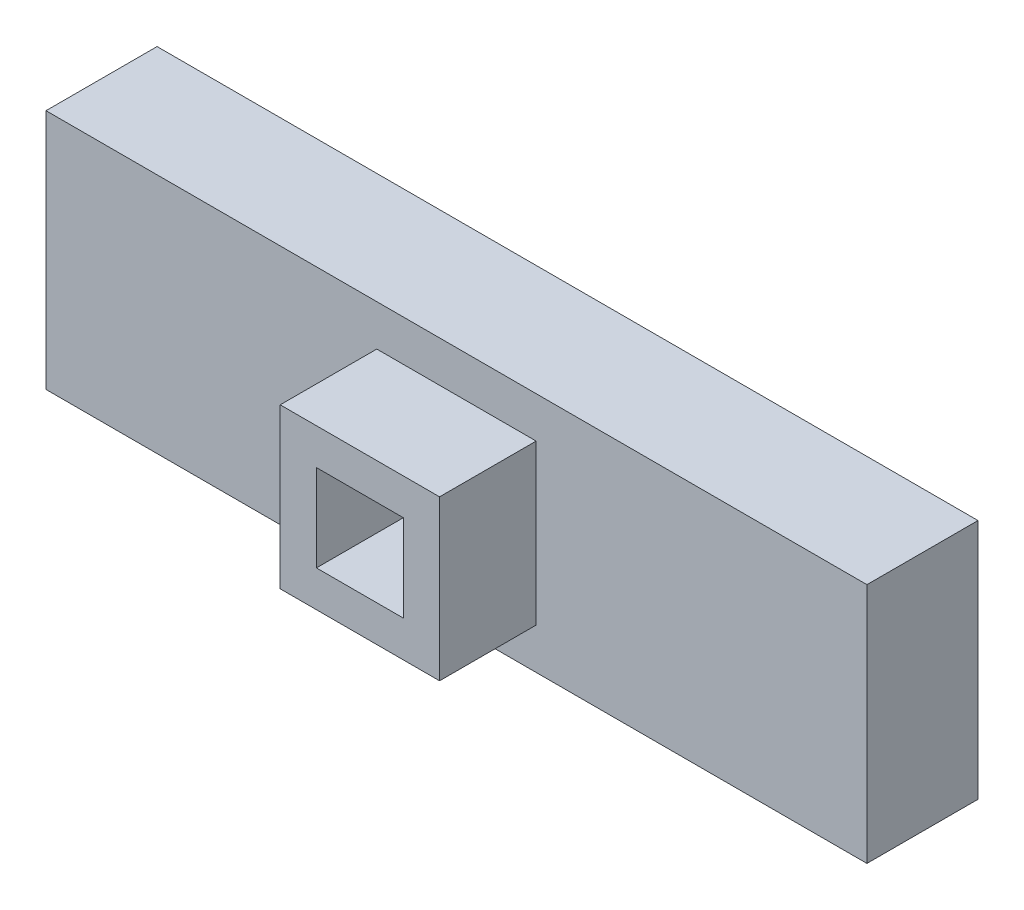
ISO-10303-21;
HEADER;
FILE_DESCRIPTION(('STEP AP214'),'2;1');
FILE_NAME('part.step','',(''),(''),'','','');
FILE_SCHEMA(('AUTOMOTIVE_DESIGN { 1 0 10303 214 1 1 1 1 }'));
ENDSEC;
DATA;
#1=APPLICATION_CONTEXT('core data for automotive mechanical design processes');
#2=APPLICATION_PROTOCOL_DEFINITION('international standard','automotive_design',2000,#1);
#3=PRODUCT_CONTEXT('',#1,'mechanical');
#4=PRODUCT('Part','Part','',(#3));
#5=PRODUCT_RELATED_PRODUCT_CATEGORY('part','',(#4));
#6=PRODUCT_DEFINITION_FORMATION('','',#4);
#7=PRODUCT_DEFINITION_CONTEXT('part definition',#1,'design');
#8=PRODUCT_DEFINITION('design','',#6,#7);
#9=PRODUCT_DEFINITION_SHAPE('','',#8);
#10=(LENGTH_UNIT() NAMED_UNIT(*) SI_UNIT(.MILLI.,.METRE.));
#11=(NAMED_UNIT(*) PLANE_ANGLE_UNIT() SI_UNIT($,.RADIAN.));
#12=(NAMED_UNIT(*) SI_UNIT($,.STERADIAN.) SOLID_ANGLE_UNIT());
#13=UNCERTAINTY_MEASURE_WITH_UNIT(LENGTH_MEASURE(1.E-05),#10,'distance_accuracy_value','');
#14=(GEOMETRIC_REPRESENTATION_CONTEXT(3) GLOBAL_UNCERTAINTY_ASSIGNED_CONTEXT((#13)) GLOBAL_UNIT_ASSIGNED_CONTEXT((#10,
#11,#12)) REPRESENTATION_CONTEXT('',''));
#15=CARTESIAN_POINT('',(0.,0.,0.));
#16=DIRECTION('',(0.,0.,1.));
#17=DIRECTION('',(1.,0.,0.));
#18=AXIS2_PLACEMENT_3D('',#15,#16,#17);
#19=CARTESIAN_POINT('',(0.,0.,0.));
#20=DIRECTION('',(0.,0.,1.));
#21=DIRECTION('',(1.,0.,0.));
#22=AXIS2_PLACEMENT_3D('',#19,#20,#21);
#23=PLANE('',#22);
#24=DIRECTION('',(0.,-1.,0.));
#25=VECTOR('',#24,1.);
#26=CARTESIAN_POINT('',(-45.2171873309762,5.44356955380577,0.));
#27=LINE('',#26,#25);
#28=CARTESIAN_POINT('',(-45.2171873309762,5.44356955380577,0.));
#29=VERTEX_POINT('',#28);
#30=CARTESIAN_POINT('',(-45.2171873309762,-4.55643044619423,0.));
#31=VERTEX_POINT('',#30);
#32=EDGE_CURVE('E315',#29,#31,#27,.T.);
#33=ORIENTED_EDGE('',*,*,#32,.F.);
#34=DIRECTION('',(-1.,0.,0.));
#35=VECTOR('',#34,1.);
#36=CARTESIAN_POINT('',(-45.2171873309762,5.44356955380577,0.));
#37=LINE('',#36,#35);
#38=CARTESIAN_POINT('',(-11.2171873309762,5.44356955380577,0.));
#39=VERTEX_POINT('',#38);
#40=EDGE_CURVE('E322',#39,#29,#37,.T.);
#41=ORIENTED_EDGE('',*,*,#40,.F.);
#42=DIRECTION('',(0.,1.,0.));
#43=VECTOR('',#42,1.);
#44=CARTESIAN_POINT('',(-11.2171873309762,5.44356955380577,0.));
#45=LINE('',#44,#43);
#46=CARTESIAN_POINT('',(-11.2171873309762,-4.55643044619423,0.));
#47=VERTEX_POINT('',#46);
#48=EDGE_CURVE('E320',#47,#39,#45,.T.);
#49=ORIENTED_EDGE('',*,*,#48,.F.);
#50=DIRECTION('',(1.,0.,0.));
#51=VECTOR('',#50,1.);
#52=CARTESIAN_POINT('',(-45.2171873309762,-4.55643044619423,0.));
#53=LINE('',#52,#51);
#54=EDGE_CURVE('E318',#31,#47,#53,.T.);
#55=ORIENTED_EDGE('',*,*,#54,.F.);
#56=EDGE_LOOP('',(#33,#41,#49,#55));
#57=FACE_BOUND('',#56,.T.);
#58=CARTESIAN_POINT('',(-14.2171873309762,0.443569553805773,0.));
#59=DIRECTION('',(0.,0.,1.));
#60=DIRECTION('',(-1.,0.,0.));
#61=AXIS2_PLACEMENT_3D('',#58,#59,#60);
#62=CIRCLE('',#61,2.);
#63=CARTESIAN_POINT('',(-14.2171873309762,-1.55643044619423,0.));
#64=VERTEX_POINT('',#63);
#65=CARTESIAN_POINT('',(-14.2171873309762,2.44356955380577,0.));
#66=VERTEX_POINT('',#65);
#67=EDGE_CURVE('E249',#64,#66,#62,.T.);
#68=ORIENTED_EDGE('',*,*,#67,.T.);
#69=DIRECTION('',(-0.994557414695274,0.104189965326093,0.));
#70=VECTOR('',#69,1.);
#71=CARTESIAN_POINT('',(-25.8409847127156,3.66128009345523,0.));
#72=LINE('',#71,#70);
#73=CARTESIAN_POINT('',(-25.8409847127156,3.66128009345523,0.));
#74=VERTEX_POINT('',#73);
#75=EDGE_CURVE('E278',#66,#74,#72,.T.);
#76=ORIENTED_EDGE('',*,*,#75,.T.);
#77=CARTESIAN_POINT('',(-28.2171873309762,0.443569553805759,0.));
#78=DIRECTION('',(0.,0.,1.));
#79=DIRECTION('',(-1.,0.,0.));
#80=AXIS2_PLACEMENT_3D('',#77,#78,#79);
#81=CIRCLE('',#80,4.00000000000001);
#82=CARTESIAN_POINT('',(-30.5933899492369,3.66128009345523,0.));
#83=VERTEX_POINT('',#82);
#84=EDGE_CURVE('E281',#74,#83,#81,.T.);
#85=ORIENTED_EDGE('',*,*,#84,.T.);
#86=DIRECTION('',(-0.994557414695274,-0.104189965326093,0.));
#87=VECTOR('',#86,1.);
#88=CARTESIAN_POINT('',(-30.5933899492369,3.66128009345523,0.));
#89=LINE('',#88,#87);
#90=CARTESIAN_POINT('',(-42.2171873309763,2.44356955380577,0.));
#91=VERTEX_POINT('',#90);
#92=EDGE_CURVE('E284',#83,#91,#89,.T.);
#93=ORIENTED_EDGE('',*,*,#92,.T.);
#94=CARTESIAN_POINT('',(-42.2171873309763,0.443569553805773,0.));
#95=DIRECTION('',(0.,0.,1.));
#96=DIRECTION('',(1.,0.,0.));
#97=AXIS2_PLACEMENT_3D('',#94,#95,#96);
#98=CIRCLE('',#97,2.);
#99=CARTESIAN_POINT('',(-42.2171873309763,-1.55643044619423,0.));
#100=VERTEX_POINT('',#99);
#101=EDGE_CURVE('E287',#91,#100,#98,.T.);
#102=ORIENTED_EDGE('',*,*,#101,.T.);
#103=DIRECTION('',(0.994557414695274,-0.104189965326093,0.));
#104=VECTOR('',#103,1.);
#105=CARTESIAN_POINT('',(-30.5933899492369,-2.77414098584369,0.));
#106=LINE('',#105,#104);
#107=CARTESIAN_POINT('',(-30.5933899492369,-2.77414098584369,0.));
#108=VERTEX_POINT('',#107);
#109=EDGE_CURVE('E290',#100,#108,#106,.T.);
#110=ORIENTED_EDGE('',*,*,#109,.T.);
#111=CARTESIAN_POINT('',(-28.2171873309762,0.443569553805785,0.));
#112=DIRECTION('',(0.,0.,1.));
#113=DIRECTION('',(1.,0.,0.));
#114=AXIS2_PLACEMENT_3D('',#111,#112,#113);
#115=CIRCLE('',#114,4.00000000000001);
#116=CARTESIAN_POINT('',(-25.8409847127156,-2.77414098584369,0.));
#117=VERTEX_POINT('',#116);
#118=EDGE_CURVE('E293',#108,#117,#115,.T.);
#119=ORIENTED_EDGE('',*,*,#118,.T.);
#120=DIRECTION('',(0.994557414695274,0.104189965326093,0.));
#121=VECTOR('',#120,1.);
#122=CARTESIAN_POINT('',(-25.8409847127156,-2.77414098584369,0.));
#123=LINE('',#122,#121);
#124=EDGE_CURVE('E254',#117,#64,#123,.T.);
#125=ORIENTED_EDGE('',*,*,#124,.T.);
#126=EDGE_LOOP('',(#68,#76,#85,#93,#102,#110,#119,#125));
#127=FACE_BOUND('',#126,.T.);
#128=ADVANCED_FACE('F32',(#57,#127),#23,.F.);
#129=CARTESIAN_POINT('',(-45.2171873309762,5.44356955380577,3.6));
#130=DIRECTION('',(1.,0.,0.));
#131=DIRECTION('',(0.,0.,-1.));
#132=AXIS2_PLACEMENT_3D('',#129,#130,#131);
#133=PLANE('',#132);
#134=ORIENTED_EDGE('',*,*,#32,.T.);
#135=DIRECTION('',(0.,0.,-1.));
#136=VECTOR('',#135,1.);
#137=CARTESIAN_POINT('',(-45.2171873309762,-4.55643044619423,3.6));
#138=LINE('',#137,#136);
#139=CARTESIAN_POINT('',(-45.2171873309762,-4.55643044619423,4.6));
#140=VERTEX_POINT('',#139);
#141=EDGE_CURVE('E11',#140,#31,#138,.T.);
#142=ORIENTED_EDGE('',*,*,#141,.F.);
#143=DIRECTION('',(0.,-1.,0.));
#144=VECTOR('',#143,1.);
#145=CARTESIAN_POINT('',(-45.2171873309762,5.44356955380577,4.6));
#146=LINE('',#145,#144);
#147=CARTESIAN_POINT('',(-45.2171873309762,5.44356955380577,4.6));
#148=VERTEX_POINT('',#147);
#149=EDGE_CURVE('E237',#148,#140,#146,.T.);
#150=ORIENTED_EDGE('',*,*,#149,.F.);
#151=DIRECTION('',(0.,0.,-1.));
#152=VECTOR('',#151,1.);
#153=CARTESIAN_POINT('',(-45.2171873309762,5.44356955380577,3.6));
#154=LINE('',#153,#152);
#155=EDGE_CURVE('E324',#148,#29,#154,.T.);
#156=ORIENTED_EDGE('',*,*,#155,.T.);
#157=EDGE_LOOP('',(#134,#142,#150,#156));
#158=FACE_BOUND('',#157,.T.);
#159=ADVANCED_FACE('F34',(#158),#133,.F.);
#160=CARTESIAN_POINT('',(-45.2171873309762,-4.55643044619423,3.6));
#161=DIRECTION('',(0.,1.,0.));
#162=DIRECTION('',(0.,0.,1.));
#163=AXIS2_PLACEMENT_3D('',#160,#161,#162);
#164=PLANE('',#163);
#165=ORIENTED_EDGE('',*,*,#54,.T.);
#166=DIRECTION('',(0.,0.,-1.));
#167=VECTOR('',#166,1.);
#168=CARTESIAN_POINT('',(-11.2171873309762,-4.55643044619423,3.6));
#169=LINE('',#168,#167);
#170=CARTESIAN_POINT('',(-11.2171873309762,-4.55643044619423,4.6));
#171=VERTEX_POINT('',#170);
#172=EDGE_CURVE('E40',#171,#47,#169,.T.);
#173=ORIENTED_EDGE('',*,*,#172,.F.);
#174=DIRECTION('',(1.,0.,0.));
#175=VECTOR('',#174,1.);
#176=CARTESIAN_POINT('',(-45.2171873309762,-4.55643044619423,4.6));
#177=LINE('',#176,#175);
#178=EDGE_CURVE('E240',#140,#171,#177,.T.);
#179=ORIENTED_EDGE('',*,*,#178,.F.);
#180=ORIENTED_EDGE('',*,*,#141,.T.);
#181=EDGE_LOOP('',(#165,#173,#179,#180));
#182=FACE_BOUND('',#181,.T.);
#183=ADVANCED_FACE('F347',(#182),#164,.F.);
#184=CARTESIAN_POINT('',(-11.2171873309762,5.44356955380577,3.6));
#185=DIRECTION('',(-1.,0.,0.));
#186=DIRECTION('',(0.,-1.,0.));
#187=AXIS2_PLACEMENT_3D('',#184,#185,#186);
#188=PLANE('',#187);
#189=ORIENTED_EDGE('',*,*,#48,.T.);
#190=DIRECTION('',(0.,0.,-1.));
#191=VECTOR('',#190,1.);
#192=CARTESIAN_POINT('',(-11.2171873309762,5.44356955380577,3.6));
#193=LINE('',#192,#191);
#194=CARTESIAN_POINT('',(-11.2171873309762,5.44356955380577,4.6));
#195=VERTEX_POINT('',#194);
#196=EDGE_CURVE('E327',#195,#39,#193,.T.);
#197=ORIENTED_EDGE('',*,*,#196,.F.);
#198=DIRECTION('',(0.,1.,0.));
#199=VECTOR('',#198,1.);
#200=CARTESIAN_POINT('',(-11.2171873309762,5.44356955380577,4.6));
#201=LINE('',#200,#199);
#202=EDGE_CURVE('E243',#171,#195,#201,.T.);
#203=ORIENTED_EDGE('',*,*,#202,.F.);
#204=ORIENTED_EDGE('',*,*,#172,.T.);
#205=EDGE_LOOP('',(#189,#197,#203,#204));
#206=FACE_BOUND('',#205,.T.);
#207=ADVANCED_FACE('F333',(#206),#188,.F.);
#208=CARTESIAN_POINT('',(-45.2171873309762,5.44356955380577,3.6));
#209=DIRECTION('',(0.,-1.,0.));
#210=DIRECTION('',(0.,0.,-1.));
#211=AXIS2_PLACEMENT_3D('',#208,#209,#210);
#212=PLANE('',#211);
#213=ORIENTED_EDGE('',*,*,#40,.T.);
#214=ORIENTED_EDGE('',*,*,#155,.F.);
#215=DIRECTION('',(-1.,0.,0.));
#216=VECTOR('',#215,1.);
#217=CARTESIAN_POINT('',(-45.2171873309762,5.44356955380577,4.6));
#218=LINE('',#217,#216);
#219=EDGE_CURVE('E246',#195,#148,#218,.T.);
#220=ORIENTED_EDGE('',*,*,#219,.F.);
#221=ORIENTED_EDGE('',*,*,#196,.T.);
#222=EDGE_LOOP('',(#213,#214,#220,#221));
#223=FACE_BOUND('',#222,.T.);
#224=ADVANCED_FACE('F341',(#223),#212,.F.);
#225=CARTESIAN_POINT('',(-14.2171873309762,0.443569553805773,3.6));
#226=DIRECTION('',(0.,0.,-1.));
#227=DIRECTION('',(-1.,0.,0.));
#228=AXIS2_PLACEMENT_3D('',#225,#226,#227);
#229=CYLINDRICAL_SURFACE('',#228,2.);
#230=ORIENTED_EDGE('',*,*,#67,.F.);
#231=DIRECTION('',(0.,0.,-1.));
#232=VECTOR('',#231,1.);
#233=CARTESIAN_POINT('',(-14.2171873309762,-1.55643044619423,3.6));
#234=LINE('',#233,#232);
#235=CARTESIAN_POINT('',(-14.2171873309762,-1.55643044619423,3.6));
#236=VERTEX_POINT('',#235);
#237=EDGE_CURVE('E275',#236,#64,#234,.T.);
#238=ORIENTED_EDGE('',*,*,#237,.F.);
#239=CARTESIAN_POINT('',(-14.2171873309762,0.443569553805773,3.6));
#240=DIRECTION('',(0.,0.,1.));
#241=DIRECTION('',(-1.,0.,0.));
#242=AXIS2_PLACEMENT_3D('',#239,#240,#241);
#243=CIRCLE('',#242,2.);
#244=CARTESIAN_POINT('',(-14.2171873309762,2.44356955380577,3.6));
#245=VERTEX_POINT('',#244);
#246=EDGE_CURVE('E250',#236,#245,#243,.T.);
#247=ORIENTED_EDGE('',*,*,#246,.T.);
#248=DIRECTION('',(0.,0.,-1.));
#249=VECTOR('',#248,1.);
#250=CARTESIAN_POINT('',(-14.2171873309762,2.44356955380577,3.6));
#251=LINE('',#250,#249);
#252=EDGE_CURVE('E312',#245,#66,#251,.T.);
#253=ORIENTED_EDGE('',*,*,#252,.T.);
#254=EDGE_LOOP('',(#230,#238,#247,#253));
#255=FACE_BOUND('',#254,.T.);
#256=ADVANCED_FACE('F360',(#255),#229,.F.);
#257=CARTESIAN_POINT('',(-25.8409847127156,3.66128009345523,3.6));
#258=DIRECTION('',(-0.104189965326093,-0.994557414695274,0.));
#259=DIRECTION('',(0.994557414695274,-0.104189965326093,0.));
#260=AXIS2_PLACEMENT_3D('',#257,#258,#259);
#261=PLANE('',#260);
#262=ORIENTED_EDGE('',*,*,#75,.F.);
#263=ORIENTED_EDGE('',*,*,#252,.F.);
#264=DIRECTION('',(-0.994557414695274,0.104189965326093,0.));
#265=VECTOR('',#264,1.);
#266=CARTESIAN_POINT('',(-25.8409847127156,3.66128009345523,3.6));
#267=LINE('',#266,#265);
#268=CARTESIAN_POINT('',(-25.8409847127156,3.66128009345523,3.6));
#269=VERTEX_POINT('',#268);
#270=EDGE_CURVE('E253',#245,#269,#267,.T.);
#271=ORIENTED_EDGE('',*,*,#270,.T.);
#272=DIRECTION('',(0.,0.,-1.));
#273=VECTOR('',#272,1.);
#274=CARTESIAN_POINT('',(-25.8409847127156,3.66128009345523,3.6));
#275=LINE('',#274,#273);
#276=EDGE_CURVE('E310',#269,#74,#275,.T.);
#277=ORIENTED_EDGE('',*,*,#276,.T.);
#278=EDGE_LOOP('',(#262,#263,#271,#277));
#279=FACE_BOUND('',#278,.T.);
#280=ADVANCED_FACE('F366',(#279),#261,.T.);
#281=CARTESIAN_POINT('',(-28.2171873309762,0.443569553805759,3.6));
#282=DIRECTION('',(0.,0.,-1.));
#283=DIRECTION('',(-1.,0.,0.));
#284=AXIS2_PLACEMENT_3D('',#281,#282,#283);
#285=CYLINDRICAL_SURFACE('',#284,4.00000000000001);
#286=ORIENTED_EDGE('',*,*,#84,.F.);
#287=ORIENTED_EDGE('',*,*,#276,.F.);
#288=CARTESIAN_POINT('',(-28.2171873309762,0.443569553805759,3.6));
#289=DIRECTION('',(0.,0.,1.));
#290=DIRECTION('',(-1.,0.,0.));
#291=AXIS2_PLACEMENT_3D('',#288,#289,#290);
#292=CIRCLE('',#291,4.00000000000001);
#293=CARTESIAN_POINT('',(-30.5933899492369,3.66128009345523,3.6));
#294=VERTEX_POINT('',#293);
#295=EDGE_CURVE('E257',#269,#294,#292,.T.);
#296=ORIENTED_EDGE('',*,*,#295,.T.);
#297=DIRECTION('',(0.,0.,-1.));
#298=VECTOR('',#297,1.);
#299=CARTESIAN_POINT('',(-30.5933899492369,3.66128009345523,3.6));
#300=LINE('',#299,#298);
#301=EDGE_CURVE('E308',#294,#83,#300,.T.);
#302=ORIENTED_EDGE('',*,*,#301,.T.);
#303=EDGE_LOOP('',(#286,#287,#296,#302));
#304=FACE_BOUND('',#303,.T.);
#305=ADVANCED_FACE('F371',(#304),#285,.F.);
#306=CARTESIAN_POINT('',(-30.5933899492369,3.66128009345523,3.6));
#307=DIRECTION('',(0.104189965326093,-0.994557414695274,0.));
#308=DIRECTION('',(0.994557414695274,0.104189965326093,0.));
#309=AXIS2_PLACEMENT_3D('',#306,#307,#308);
#310=PLANE('',#309);
#311=ORIENTED_EDGE('',*,*,#92,.F.);
#312=ORIENTED_EDGE('',*,*,#301,.F.);
#313=DIRECTION('',(-0.994557414695274,-0.104189965326093,0.));
#314=VECTOR('',#313,1.);
#315=CARTESIAN_POINT('',(-30.5933899492369,3.66128009345523,3.6));
#316=LINE('',#315,#314);
#317=CARTESIAN_POINT('',(-42.2171873309763,2.44356955380577,3.6));
#318=VERTEX_POINT('',#317);
#319=EDGE_CURVE('E260',#294,#318,#316,.T.);
#320=ORIENTED_EDGE('',*,*,#319,.T.);
#321=DIRECTION('',(0.,0.,-1.));
#322=VECTOR('',#321,1.);
#323=CARTESIAN_POINT('',(-42.2171873309763,2.44356955380577,3.6));
#324=LINE('',#323,#322);
#325=EDGE_CURVE('E306',#318,#91,#324,.T.);
#326=ORIENTED_EDGE('',*,*,#325,.T.);
#327=EDGE_LOOP('',(#311,#312,#320,#326));
#328=FACE_BOUND('',#327,.T.);
#329=ADVANCED_FACE('F396',(#328),#310,.T.);
#330=CARTESIAN_POINT('',(-42.2171873309763,0.443569553805773,3.6));
#331=DIRECTION('',(0.,0.,-1.));
#332=DIRECTION('',(-1.,0.,0.));
#333=AXIS2_PLACEMENT_3D('',#330,#331,#332);
#334=CYLINDRICAL_SURFACE('',#333,2.);
#335=ORIENTED_EDGE('',*,*,#101,.F.);
#336=ORIENTED_EDGE('',*,*,#325,.F.);
#337=CARTESIAN_POINT('',(-42.2171873309763,0.443569553805773,3.6));
#338=DIRECTION('',(0.,0.,1.));
#339=DIRECTION('',(1.,0.,0.));
#340=AXIS2_PLACEMENT_3D('',#337,#338,#339);
#341=CIRCLE('',#340,2.);
#342=CARTESIAN_POINT('',(-42.2171873309763,-1.55643044619423,3.6));
#343=VERTEX_POINT('',#342);
#344=EDGE_CURVE('E263',#318,#343,#341,.T.);
#345=ORIENTED_EDGE('',*,*,#344,.T.);
#346=DIRECTION('',(0.,0.,-1.));
#347=VECTOR('',#346,1.);
#348=CARTESIAN_POINT('',(-42.2171873309763,-1.55643044619423,3.6));
#349=LINE('',#348,#347);
#350=EDGE_CURVE('E304',#343,#100,#349,.T.);
#351=ORIENTED_EDGE('',*,*,#350,.T.);
#352=EDGE_LOOP('',(#335,#336,#345,#351));
#353=FACE_BOUND('',#352,.T.);
#354=ADVANCED_FACE('F391',(#353),#334,.F.);
#355=CARTESIAN_POINT('',(-30.5933899492369,-2.77414098584369,3.6));
#356=DIRECTION('',(0.104189965326093,0.994557414695274,0.));
#357=DIRECTION('',(-0.994557414695274,0.104189965326093,0.));
#358=AXIS2_PLACEMENT_3D('',#355,#356,#357);
#359=PLANE('',#358);
#360=ORIENTED_EDGE('',*,*,#109,.F.);
#361=ORIENTED_EDGE('',*,*,#350,.F.);
#362=DIRECTION('',(0.994557414695274,-0.104189965326093,0.));
#363=VECTOR('',#362,1.);
#364=CARTESIAN_POINT('',(-30.5933899492369,-2.77414098584369,3.6));
#365=LINE('',#364,#363);
#366=CARTESIAN_POINT('',(-30.5933899492369,-2.77414098584369,3.6));
#367=VERTEX_POINT('',#366);
#368=EDGE_CURVE('E266',#343,#367,#365,.T.);
#369=ORIENTED_EDGE('',*,*,#368,.T.);
#370=DIRECTION('',(0.,0.,-1.));
#371=VECTOR('',#370,1.);
#372=CARTESIAN_POINT('',(-30.5933899492369,-2.77414098584369,3.6));
#373=LINE('',#372,#371);
#374=EDGE_CURVE('E302',#367,#108,#373,.T.);
#375=ORIENTED_EDGE('',*,*,#374,.T.);
#376=EDGE_LOOP('',(#360,#361,#369,#375));
#377=FACE_BOUND('',#376,.T.);
#378=ADVANCED_FACE('F388',(#377),#359,.T.);
#379=CARTESIAN_POINT('',(-28.2171873309762,0.443569553805785,3.6));
#380=DIRECTION('',(0.,0.,-1.));
#381=DIRECTION('',(-1.,0.,0.));
#382=AXIS2_PLACEMENT_3D('',#379,#380,#381);
#383=CYLINDRICAL_SURFACE('',#382,4.00000000000001);
#384=ORIENTED_EDGE('',*,*,#118,.F.);
#385=ORIENTED_EDGE('',*,*,#374,.F.);
#386=CARTESIAN_POINT('',(-28.2171873309762,0.443569553805785,3.6));
#387=DIRECTION('',(0.,0.,1.));
#388=DIRECTION('',(1.,0.,0.));
#389=AXIS2_PLACEMENT_3D('',#386,#387,#388);
#390=CIRCLE('',#389,4.00000000000001);
#391=CARTESIAN_POINT('',(-25.8409847127156,-2.77414098584369,3.6));
#392=VERTEX_POINT('',#391);
#393=EDGE_CURVE('E269',#367,#392,#390,.T.);
#394=ORIENTED_EDGE('',*,*,#393,.T.);
#395=DIRECTION('',(0.,0.,-1.));
#396=VECTOR('',#395,1.);
#397=CARTESIAN_POINT('',(-25.8409847127156,-2.77414098584369,3.6));
#398=LINE('',#397,#396);
#399=EDGE_CURVE('E300',#392,#117,#398,.T.);
#400=ORIENTED_EDGE('',*,*,#399,.T.);
#401=EDGE_LOOP('',(#384,#385,#394,#400));
#402=FACE_BOUND('',#401,.T.);
#403=ADVANCED_FACE('F383',(#402),#383,.F.);
#404=CARTESIAN_POINT('',(-25.8409847127156,-2.77414098584369,3.6));
#405=DIRECTION('',(-0.104189965326093,0.994557414695274,0.));
#406=DIRECTION('',(-0.994557414695274,-0.104189965326093,0.));
#407=AXIS2_PLACEMENT_3D('',#404,#405,#406);
#408=PLANE('',#407);
#409=ORIENTED_EDGE('',*,*,#124,.F.);
#410=ORIENTED_EDGE('',*,*,#399,.F.);
#411=DIRECTION('',(0.994557414695274,0.104189965326093,0.));
#412=VECTOR('',#411,1.);
#413=CARTESIAN_POINT('',(-25.8409847127156,-2.77414098584369,3.6));
#414=LINE('',#413,#412);
#415=EDGE_CURVE('E272',#392,#236,#414,.T.);
#416=ORIENTED_EDGE('',*,*,#415,.T.);
#417=ORIENTED_EDGE('',*,*,#237,.T.);
#418=EDGE_LOOP('',(#409,#410,#416,#417));
#419=FACE_BOUND('',#418,.T.);
#420=ADVANCED_FACE('F377',(#419),#408,.T.);
#421=CARTESIAN_POINT('',(0.,0.,3.6));
#422=DIRECTION('',(0.,0.,1.));
#423=DIRECTION('',(1.,0.,0.));
#424=AXIS2_PLACEMENT_3D('',#421,#422,#423);
#425=PLANE('',#424);
#426=ORIENTED_EDGE('',*,*,#270,.F.);
#427=ORIENTED_EDGE('',*,*,#246,.F.);
#428=ORIENTED_EDGE('',*,*,#415,.F.);
#429=ORIENTED_EDGE('',*,*,#393,.F.);
#430=ORIENTED_EDGE('',*,*,#368,.F.);
#431=ORIENTED_EDGE('',*,*,#344,.F.);
#432=ORIENTED_EDGE('',*,*,#319,.F.);
#433=ORIENTED_EDGE('',*,*,#295,.F.);
#434=EDGE_LOOP('',(#426,#427,#428,#429,#430,#431,#432,#433));
#435=FACE_BOUND('',#434,.T.);
#436=ADVANCED_FACE('F385',(#435),#425,.F.);
#437=CARTESIAN_POINT('',(0.,0.,4.6));
#438=DIRECTION('',(0.,0.,1.));
#439=DIRECTION('',(1.,0.,0.));
#440=AXIS2_PLACEMENT_3D('',#437,#438,#439);
#441=PLANE('',#440);
#442=DIRECTION('',(0.,1.,0.));
#443=VECTOR('',#442,1.);
#444=CARTESIAN_POINT('',(-24.9171873309762,3.74356955380577,4.6));
#445=LINE('',#444,#443);
#446=CARTESIAN_POINT('',(-24.9171873309762,-2.85643044619423,4.6));
#447=VERTEX_POINT('',#446);
#448=CARTESIAN_POINT('',(-24.9171873309762,3.74356955380577,4.6));
#449=VERTEX_POINT('',#448);
#450=EDGE_CURVE('E47',#447,#449,#445,.T.);
#451=ORIENTED_EDGE('',*,*,#450,.F.);
#452=DIRECTION('',(1.,0.,0.));
#453=VECTOR('',#452,1.);
#454=CARTESIAN_POINT('',(-31.5171873309762,-2.85643044619423,4.6));
#455=LINE('',#454,#453);
#456=CARTESIAN_POINT('',(-31.5171873309762,-2.85643044619423,4.6));
#457=VERTEX_POINT('',#456);
#458=EDGE_CURVE('E51',#457,#447,#455,.T.);
#459=ORIENTED_EDGE('',*,*,#458,.F.);
#460=DIRECTION('',(0.,-1.,0.));
#461=VECTOR('',#460,1.);
#462=CARTESIAN_POINT('',(-31.5171873309762,3.74356955380577,4.6));
#463=LINE('',#462,#461);
#464=CARTESIAN_POINT('',(-31.5171873309762,3.74356955380577,4.6));
#465=VERTEX_POINT('',#464);
#466=EDGE_CURVE('E223',#465,#457,#463,.T.);
#467=ORIENTED_EDGE('',*,*,#466,.F.);
#468=DIRECTION('',(-1.,0.,0.));
#469=VECTOR('',#468,1.);
#470=CARTESIAN_POINT('',(-31.5171873309762,3.74356955380577,4.6));
#471=LINE('',#470,#469);
#472=EDGE_CURVE('E220',#449,#465,#471,.T.);
#473=ORIENTED_EDGE('',*,*,#472,.F.);
#474=EDGE_LOOP('',(#451,#459,#467,#473));
#475=FACE_BOUND('',#474,.T.);
#476=ORIENTED_EDGE('',*,*,#149,.T.);
#477=ORIENTED_EDGE('',*,*,#178,.T.);
#478=ORIENTED_EDGE('',*,*,#202,.T.);
#479=ORIENTED_EDGE('',*,*,#219,.T.);
#480=EDGE_LOOP('',(#476,#477,#478,#479));
#481=FACE_BOUND('',#480,.T.);
#482=ADVANCED_FACE('F346',(#475,#481),#441,.T.);
#483=CARTESIAN_POINT('',(0.,0.,8.6));
#484=DIRECTION('',(0.,0.,1.));
#485=DIRECTION('',(1.,0.,0.));
#486=AXIS2_PLACEMENT_3D('',#483,#484,#485);
#487=PLANE('',#486);
#488=DIRECTION('',(0.,1.,0.));
#489=VECTOR('',#488,1.);
#490=CARTESIAN_POINT('',(-24.9171873309762,3.74356955380577,8.6));
#491=LINE('',#490,#489);
#492=CARTESIAN_POINT('',(-24.9171873309762,-2.85643044619423,8.6));
#493=VERTEX_POINT('',#492);
#494=CARTESIAN_POINT('',(-24.9171873309762,3.74356955380577,8.6));
#495=VERTEX_POINT('',#494);
#496=EDGE_CURVE('E209',#493,#495,#491,.T.);
#497=ORIENTED_EDGE('',*,*,#496,.T.);
#498=DIRECTION('',(-1.,0.,0.));
#499=VECTOR('',#498,1.);
#500=CARTESIAN_POINT('',(-31.5171873309762,3.74356955380577,8.6));
#501=LINE('',#500,#499);
#502=CARTESIAN_POINT('',(-31.5171873309762,3.74356955380577,8.6));
#503=VERTEX_POINT('',#502);
#504=EDGE_CURVE('E212',#495,#503,#501,.T.);
#505=ORIENTED_EDGE('',*,*,#504,.T.);
#506=DIRECTION('',(0.,-1.,0.));
#507=VECTOR('',#506,1.);
#508=CARTESIAN_POINT('',(-31.5171873309762,3.74356955380577,8.6));
#509=LINE('',#508,#507);
#510=CARTESIAN_POINT('',(-31.5171873309762,-2.85643044619423,8.6));
#511=VERTEX_POINT('',#510);
#512=EDGE_CURVE('E214',#503,#511,#509,.T.);
#513=ORIENTED_EDGE('',*,*,#512,.T.);
#514=DIRECTION('',(1.,0.,0.));
#515=VECTOR('',#514,1.);
#516=CARTESIAN_POINT('',(-31.5171873309762,-2.85643044619423,8.6));
#517=LINE('',#516,#515);
#518=EDGE_CURVE('E216',#511,#493,#517,.T.);
#519=ORIENTED_EDGE('',*,*,#518,.T.);
#520=EDGE_LOOP('',(#497,#505,#513,#519));
#521=FACE_BOUND('',#520,.T.);
#522=DIRECTION('',(-1.,0.,0.));
#523=VECTOR('',#522,1.);
#524=CARTESIAN_POINT('',(-30.0171873309762,2.24356955380577,8.6));
#525=LINE('',#524,#523);
#526=CARTESIAN_POINT('',(-26.4171873309762,2.24356955380577,8.6));
#527=VERTEX_POINT('',#526);
#528=CARTESIAN_POINT('',(-30.0171873309762,2.24356955380577,8.6));
#529=VERTEX_POINT('',#528);
#530=EDGE_CURVE('E178',#527,#529,#525,.T.);
#531=ORIENTED_EDGE('',*,*,#530,.F.);
#532=DIRECTION('',(0.,1.,0.));
#533=VECTOR('',#532,1.);
#534=CARTESIAN_POINT('',(-26.4171873309762,-1.35643044619423,8.6));
#535=LINE('',#534,#533);
#536=CARTESIAN_POINT('',(-26.4171873309762,-1.35643044619423,8.6));
#537=VERTEX_POINT('',#536);
#538=EDGE_CURVE('E168',#537,#527,#535,.T.);
#539=ORIENTED_EDGE('',*,*,#538,.F.);
#540=DIRECTION('',(1.,0.,0.));
#541=VECTOR('',#540,1.);
#542=CARTESIAN_POINT('',(-30.0171873309762,-1.35643044619423,8.6));
#543=LINE('',#542,#541);
#544=CARTESIAN_POINT('',(-30.0171873309762,-1.35643044619423,8.6));
#545=VERTEX_POINT('',#544);
#546=EDGE_CURVE('E193',#545,#537,#543,.T.);
#547=ORIENTED_EDGE('',*,*,#546,.F.);
#548=DIRECTION('',(0.,-1.,0.));
#549=VECTOR('',#548,1.);
#550=CARTESIAN_POINT('',(-30.0171873309762,-1.35643044619423,8.6));
#551=LINE('',#550,#549);
#552=EDGE_CURVE('E191',#529,#545,#551,.T.);
#553=ORIENTED_EDGE('',*,*,#552,.F.);
#554=EDGE_LOOP('',(#531,#539,#547,#553));
#555=FACE_BOUND('',#554,.T.);
#556=ADVANCED_FACE('F189',(#521,#555),#487,.T.);
#557=CARTESIAN_POINT('',(-24.9171873309762,3.74356955380577,8.6));
#558=DIRECTION('',(-1.,0.,0.));
#559=DIRECTION('',(0.,0.,1.));
#560=AXIS2_PLACEMENT_3D('',#557,#558,#559);
#561=PLANE('',#560);
#562=ORIENTED_EDGE('',*,*,#450,.T.);
#563=DIRECTION('',(0.,0.,-1.));
#564=VECTOR('',#563,1.);
#565=CARTESIAN_POINT('',(-24.9171873309762,3.74356955380577,8.6));
#566=LINE('',#565,#564);
#567=EDGE_CURVE('E234',#495,#449,#566,.T.);
#568=ORIENTED_EDGE('',*,*,#567,.F.);
#569=ORIENTED_EDGE('',*,*,#496,.F.);
#570=DIRECTION('',(0.,0.,-1.));
#571=VECTOR('',#570,1.);
#572=CARTESIAN_POINT('',(-24.9171873309762,-2.85643044619423,8.6));
#573=LINE('',#572,#571);
#574=EDGE_CURVE('E218',#493,#447,#573,.T.);
#575=ORIENTED_EDGE('',*,*,#574,.T.);
#576=EDGE_LOOP('',(#562,#568,#569,#575));
#577=FACE_BOUND('',#576,.T.);
#578=ADVANCED_FACE('F420',(#577),#561,.F.);
#579=CARTESIAN_POINT('',(-31.5171873309762,3.74356955380577,8.6));
#580=DIRECTION('',(0.,-1.,0.));
#581=DIRECTION('',(0.,0.,-1.));
#582=AXIS2_PLACEMENT_3D('',#579,#580,#581);
#583=PLANE('',#582);
#584=ORIENTED_EDGE('',*,*,#472,.T.);
#585=DIRECTION('',(0.,0.,-1.));
#586=VECTOR('',#585,1.);
#587=CARTESIAN_POINT('',(-31.5171873309762,3.74356955380577,8.6));
#588=LINE('',#587,#586);
#589=EDGE_CURVE('E231',#503,#465,#588,.T.);
#590=ORIENTED_EDGE('',*,*,#589,.F.);
#591=ORIENTED_EDGE('',*,*,#504,.F.);
#592=ORIENTED_EDGE('',*,*,#567,.T.);
#593=EDGE_LOOP('',(#584,#590,#591,#592));
#594=FACE_BOUND('',#593,.T.);
#595=ADVANCED_FACE('F423',(#594),#583,.F.);
#596=CARTESIAN_POINT('',(-31.5171873309762,3.74356955380577,8.6));
#597=DIRECTION('',(1.,0.,0.));
#598=DIRECTION('',(0.,0.,-1.));
#599=AXIS2_PLACEMENT_3D('',#596,#597,#598);
#600=PLANE('',#599);
#601=ORIENTED_EDGE('',*,*,#466,.T.);
#602=DIRECTION('',(0.,0.,-1.));
#603=VECTOR('',#602,1.);
#604=CARTESIAN_POINT('',(-31.5171873309762,-2.85643044619423,8.6));
#605=LINE('',#604,#603);
#606=EDGE_CURVE('E228',#511,#457,#605,.T.);
#607=ORIENTED_EDGE('',*,*,#606,.F.);
#608=ORIENTED_EDGE('',*,*,#512,.F.);
#609=ORIENTED_EDGE('',*,*,#589,.T.);
#610=EDGE_LOOP('',(#601,#607,#608,#609));
#611=FACE_BOUND('',#610,.T.);
#612=ADVANCED_FACE('F427',(#611),#600,.F.);
#613=CARTESIAN_POINT('',(-31.5171873309762,-2.85643044619423,8.6));
#614=DIRECTION('',(0.,1.,0.));
#615=DIRECTION('',(0.,0.,1.));
#616=AXIS2_PLACEMENT_3D('',#613,#614,#615);
#617=PLANE('',#616);
#618=ORIENTED_EDGE('',*,*,#458,.T.);
#619=ORIENTED_EDGE('',*,*,#574,.F.);
#620=ORIENTED_EDGE('',*,*,#518,.F.);
#621=ORIENTED_EDGE('',*,*,#606,.T.);
#622=EDGE_LOOP('',(#618,#619,#620,#621));
#623=FACE_BOUND('',#622,.T.);
#624=ADVANCED_FACE('F431',(#623),#617,.F.);
#625=CARTESIAN_POINT('',(-26.4171873309762,-1.35643044619423,8.6));
#626=DIRECTION('',(-1.,0.,0.));
#627=DIRECTION('',(0.,0.,1.));
#628=AXIS2_PLACEMENT_3D('',#625,#626,#627);
#629=PLANE('',#628);
#630=DIRECTION('',(0.,1.,0.));
#631=VECTOR('',#630,1.);
#632=CARTESIAN_POINT('',(-26.4171873309762,-1.35643044619423,4.6));
#633=LINE('',#632,#631);
#634=CARTESIAN_POINT('',(-26.4171873309762,-1.35643044619423,4.6));
#635=VERTEX_POINT('',#634);
#636=CARTESIAN_POINT('',(-26.4171873309762,2.24356955380577,4.6));
#637=VERTEX_POINT('',#636);
#638=EDGE_CURVE('E197',#635,#637,#633,.T.);
#639=ORIENTED_EDGE('',*,*,#638,.F.);
#640=DIRECTION('',(0.,0.,-1.));
#641=VECTOR('',#640,1.);
#642=CARTESIAN_POINT('',(-26.4171873309762,-1.35643044619423,8.6));
#643=LINE('',#642,#641);
#644=EDGE_CURVE('E174',#537,#635,#643,.T.);
#645=ORIENTED_EDGE('',*,*,#644,.F.);
#646=ORIENTED_EDGE('',*,*,#538,.T.);
#647=DIRECTION('',(0.,0.,-1.));
#648=VECTOR('',#647,1.);
#649=CARTESIAN_POINT('',(-26.4171873309762,2.24356955380577,8.6));
#650=LINE('',#649,#648);
#651=EDGE_CURVE('E172',#527,#637,#650,.T.);
#652=ORIENTED_EDGE('',*,*,#651,.T.);
#653=EDGE_LOOP('',(#639,#645,#646,#652));
#654=FACE_BOUND('',#653,.T.);
#655=ADVANCED_FACE('F171',(#654),#629,.T.);
#656=CARTESIAN_POINT('',(-30.0171873309762,2.24356955380577,8.6));
#657=DIRECTION('',(0.,-1.,0.));
#658=DIRECTION('',(0.,0.,-1.));
#659=AXIS2_PLACEMENT_3D('',#656,#657,#658);
#660=PLANE('',#659);
#661=DIRECTION('',(-1.,0.,0.));
#662=VECTOR('',#661,1.);
#663=CARTESIAN_POINT('',(-30.0171873309762,2.24356955380577,4.6));
#664=LINE('',#663,#662);
#665=CARTESIAN_POINT('',(-30.0171873309762,2.24356955380577,4.6));
#666=VERTEX_POINT('',#665);
#667=EDGE_CURVE('E185',#637,#666,#664,.T.);
#668=ORIENTED_EDGE('',*,*,#667,.F.);
#669=ORIENTED_EDGE('',*,*,#651,.F.);
#670=ORIENTED_EDGE('',*,*,#530,.T.);
#671=DIRECTION('',(0.,0.,-1.));
#672=VECTOR('',#671,1.);
#673=CARTESIAN_POINT('',(-30.0171873309762,2.24356955380577,8.6));
#674=LINE('',#673,#672);
#675=EDGE_CURVE('E186',#529,#666,#674,.T.);
#676=ORIENTED_EDGE('',*,*,#675,.T.);
#677=EDGE_LOOP('',(#668,#669,#670,#676));
#678=FACE_BOUND('',#677,.T.);
#679=ADVANCED_FACE('F182',(#678),#660,.T.);
#680=CARTESIAN_POINT('',(-30.0171873309762,-1.35643044619423,8.6));
#681=DIRECTION('',(1.,0.,0.));
#682=DIRECTION('',(0.,0.,-1.));
#683=AXIS2_PLACEMENT_3D('',#680,#681,#682);
#684=PLANE('',#683);
#685=DIRECTION('',(0.,-1.,0.));
#686=VECTOR('',#685,1.);
#687=CARTESIAN_POINT('',(-30.0171873309762,-1.35643044619423,4.6));
#688=LINE('',#687,#686);
#689=CARTESIAN_POINT('',(-30.0171873309762,-1.35643044619423,4.6));
#690=VERTEX_POINT('',#689);
#691=EDGE_CURVE('E200',#666,#690,#688,.T.);
#692=ORIENTED_EDGE('',*,*,#691,.F.);
#693=ORIENTED_EDGE('',*,*,#675,.F.);
#694=ORIENTED_EDGE('',*,*,#552,.T.);
#695=DIRECTION('',(0.,0.,-1.));
#696=VECTOR('',#695,1.);
#697=CARTESIAN_POINT('',(-30.0171873309762,-1.35643044619423,8.6));
#698=LINE('',#697,#696);
#699=EDGE_CURVE('E206',#545,#690,#698,.T.);
#700=ORIENTED_EDGE('',*,*,#699,.T.);
#701=EDGE_LOOP('',(#692,#693,#694,#700));
#702=FACE_BOUND('',#701,.T.);
#703=ADVANCED_FACE('F443',(#702),#684,.T.);
#704=CARTESIAN_POINT('',(-30.0171873309762,-1.35643044619423,8.6));
#705=DIRECTION('',(0.,1.,0.));
#706=DIRECTION('',(0.,0.,1.));
#707=AXIS2_PLACEMENT_3D('',#704,#705,#706);
#708=PLANE('',#707);
#709=DIRECTION('',(1.,0.,0.));
#710=VECTOR('',#709,1.);
#711=CARTESIAN_POINT('',(-30.0171873309762,-1.35643044619423,4.6));
#712=LINE('',#711,#710);
#713=EDGE_CURVE('E179',#690,#635,#712,.T.);
#714=ORIENTED_EDGE('',*,*,#713,.F.);
#715=ORIENTED_EDGE('',*,*,#699,.F.);
#716=ORIENTED_EDGE('',*,*,#546,.T.);
#717=ORIENTED_EDGE('',*,*,#644,.T.);
#718=EDGE_LOOP('',(#714,#715,#716,#717));
#719=FACE_BOUND('',#718,.T.);
#720=ADVANCED_FACE('F446',(#719),#708,.T.);
#721=ORIENTED_EDGE('',*,*,#713,.T.);
#722=ORIENTED_EDGE('',*,*,#638,.T.);
#723=ORIENTED_EDGE('',*,*,#667,.T.);
#724=ORIENTED_EDGE('',*,*,#691,.T.);
#725=EDGE_LOOP('',(#721,#722,#723,#724));
#726=FACE_BOUND('',#725,.T.);
#727=ADVANCED_FACE('F419',(#726),#441,.T.);
#728=CLOSED_SHELL('',(#128,#159,#183,#207,#224,#256,#280,#305,#329,#354,#378,#403,#420,#436,
#482,#556,#578,#595,#612,#624,#655,#679,#703,#720,#727));
#729=MANIFOLD_SOLID_BREP('B2',#728);
#730=ADVANCED_BREP_SHAPE_REPRESENTATION('',(#18,#729),#14);
#731=SHAPE_DEFINITION_REPRESENTATION(#9,#730);
ENDSEC;
END-ISO-10303-21;
